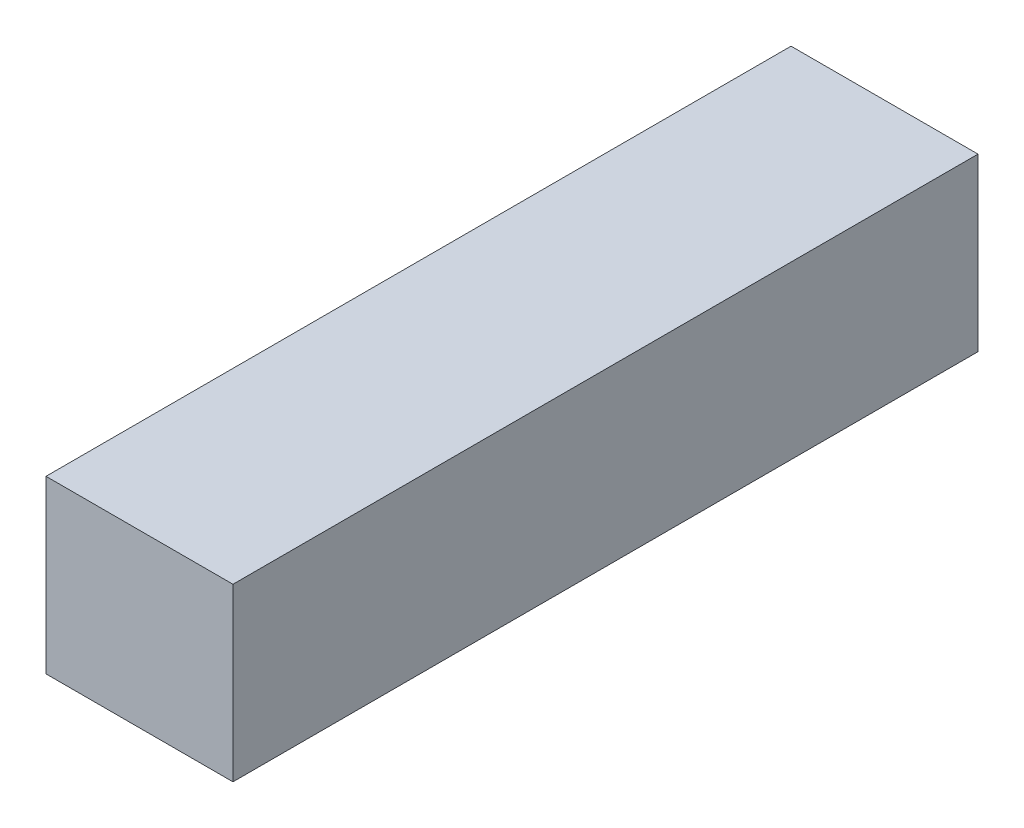
ISO-10303-21;
HEADER;
FILE_DESCRIPTION(('STEP AP214'),'2;1');
FILE_NAME('part.step','',(''),(''),'','','');
FILE_SCHEMA(('AUTOMOTIVE_DESIGN { 1 0 10303 214 1 1 1 1 }'));
ENDSEC;
DATA;
#1=APPLICATION_CONTEXT('core data for automotive mechanical design processes');
#2=APPLICATION_PROTOCOL_DEFINITION('international standard','automotive_design',2000,#1);
#3=PRODUCT_CONTEXT('',#1,'mechanical');
#4=PRODUCT('Part','Part','',(#3));
#5=PRODUCT_RELATED_PRODUCT_CATEGORY('part','',(#4));
#6=PRODUCT_DEFINITION_FORMATION('','',#4);
#7=PRODUCT_DEFINITION_CONTEXT('part definition',#1,'design');
#8=PRODUCT_DEFINITION('design','',#6,#7);
#9=PRODUCT_DEFINITION_SHAPE('','',#8);
#10=(LENGTH_UNIT() NAMED_UNIT(*) SI_UNIT(.MILLI.,.METRE.));
#11=(NAMED_UNIT(*) PLANE_ANGLE_UNIT() SI_UNIT($,.RADIAN.));
#12=(NAMED_UNIT(*) SI_UNIT($,.STERADIAN.) SOLID_ANGLE_UNIT());
#13=UNCERTAINTY_MEASURE_WITH_UNIT(LENGTH_MEASURE(1.E-05),#10,'distance_accuracy_value','');
#14=(GEOMETRIC_REPRESENTATION_CONTEXT(3) GLOBAL_UNCERTAINTY_ASSIGNED_CONTEXT((#13)) GLOBAL_UNIT_ASSIGNED_CONTEXT((#10,
#11,#12)) REPRESENTATION_CONTEXT('',''));
#15=CARTESIAN_POINT('',(0.,0.,0.));
#16=DIRECTION('',(0.,0.,1.));
#17=DIRECTION('',(1.,0.,0.));
#18=AXIS2_PLACEMENT_3D('',#15,#16,#17);
#19=CARTESIAN_POINT('',(5.586378185882,1.4780431679862,0.));
#20=DIRECTION('',(1.,0.,0.));
#21=DIRECTION('',(0.,1.,0.));
#22=AXIS2_PLACEMENT_3D('',#19,#20,#21);
#23=PLANE('',#22);
#24=DIRECTION('',(0.,-1.,0.));
#25=VECTOR('',#24,1.);
#26=CARTESIAN_POINT('',(5.586378185882,1.5010119861224,0.));
#27=LINE('',#26,#25);
#28=CARTESIAN_POINT('',(5.586378185882,1.5010119861224,0.));
#29=VERTEX_POINT('',#28);
#30=CARTESIAN_POINT('',(5.586378185882,1.4780431679862,0.));
#31=VERTEX_POINT('',#30);
#32=EDGE_CURVE('E11',#29,#31,#27,.T.);
#33=ORIENTED_EDGE('',*,*,#32,.F.);
#34=DIRECTION('',(0.,0.,1.));
#35=VECTOR('',#34,1.);
#36=CARTESIAN_POINT('',(5.586378185882,1.5010119861224,0.));
#37=LINE('',#36,#35);
#38=CARTESIAN_POINT('',(5.586378185882,1.5010119861224,0.1));
#39=VERTEX_POINT('',#38);
#40=EDGE_CURVE('E24',#29,#39,#37,.T.);
#41=ORIENTED_EDGE('',*,*,#40,.T.);
#42=DIRECTION('',(0.,1.,0.));
#43=VECTOR('',#42,1.);
#44=CARTESIAN_POINT('',(5.586378185882,1.5010119861224,0.1));
#45=LINE('',#44,#43);
#46=CARTESIAN_POINT('',(5.586378185882,1.4780431679862,0.1));
#47=VERTEX_POINT('',#46);
#48=EDGE_CURVE('E75',#47,#39,#45,.T.);
#49=ORIENTED_EDGE('',*,*,#48,.F.);
#50=DIRECTION('',(0.,0.,1.));
#51=VECTOR('',#50,1.);
#52=CARTESIAN_POINT('',(5.586378185882,1.4780431679862,0.));
#53=LINE('',#52,#51);
#54=EDGE_CURVE('E85',#31,#47,#53,.T.);
#55=ORIENTED_EDGE('',*,*,#54,.F.);
#56=EDGE_LOOP('',(#33,#41,#49,#55));
#57=FACE_BOUND('',#56,.T.);
#58=ADVANCED_FACE('F17',(#57),#23,.T.);
#59=CARTESIAN_POINT('',(5.5612826253258,1.4780431679862,0.));
#60=DIRECTION('',(0.,-1.,0.));
#61=DIRECTION('',(1.,0.,0.));
#62=AXIS2_PLACEMENT_3D('',#59,#60,#61);
#63=PLANE('',#62);
#64=DIRECTION('',(-1.,0.,0.));
#65=VECTOR('',#64,1.);
#66=CARTESIAN_POINT('',(5.586378185882,1.4780431679862,0.));
#67=LINE('',#66,#65);
#68=CARTESIAN_POINT('',(5.5612826253258,1.4780431679862,0.));
#69=VERTEX_POINT('',#68);
#70=EDGE_CURVE('E83',#31,#69,#67,.T.);
#71=ORIENTED_EDGE('',*,*,#70,.F.);
#72=ORIENTED_EDGE('',*,*,#54,.T.);
#73=DIRECTION('',(1.,0.,0.));
#74=VECTOR('',#73,1.);
#75=CARTESIAN_POINT('',(5.586378185882,1.4780431679862,0.1));
#76=LINE('',#75,#74);
#77=CARTESIAN_POINT('',(5.5612826253258,1.4780431679862,0.1));
#78=VERTEX_POINT('',#77);
#79=EDGE_CURVE('E81',#78,#47,#76,.T.);
#80=ORIENTED_EDGE('',*,*,#79,.F.);
#81=DIRECTION('',(0.,0.,1.));
#82=VECTOR('',#81,1.);
#83=CARTESIAN_POINT('',(5.5612826253258,1.4780431679862,0.));
#84=LINE('',#83,#82);
#85=EDGE_CURVE('E61',#69,#78,#84,.T.);
#86=ORIENTED_EDGE('',*,*,#85,.F.);
#87=EDGE_LOOP('',(#71,#72,#80,#86));
#88=FACE_BOUND('',#87,.T.);
#89=ADVANCED_FACE('F91',(#88),#63,.T.);
#90=CARTESIAN_POINT('',(5.5612826253258,1.5010119861224,0.));
#91=DIRECTION('',(-1.,0.,0.));
#92=DIRECTION('',(0.,-1.,0.));
#93=AXIS2_PLACEMENT_3D('',#90,#91,#92);
#94=PLANE('',#93);
#95=DIRECTION('',(0.,1.,0.));
#96=VECTOR('',#95,1.);
#97=CARTESIAN_POINT('',(5.5612826253258,1.4780431679862,0.));
#98=LINE('',#97,#96);
#99=CARTESIAN_POINT('',(5.5612826253258,1.5010119861224,0.));
#100=VERTEX_POINT('',#99);
#101=EDGE_CURVE('E65',#69,#100,#98,.T.);
#102=ORIENTED_EDGE('',*,*,#101,.F.);
#103=ORIENTED_EDGE('',*,*,#85,.T.);
#104=DIRECTION('',(0.,-1.,0.));
#105=VECTOR('',#104,1.);
#106=CARTESIAN_POINT('',(5.5612826253258,1.4780431679862,0.1));
#107=LINE('',#106,#105);
#108=CARTESIAN_POINT('',(5.5612826253258,1.5010119861224,0.1));
#109=VERTEX_POINT('',#108);
#110=EDGE_CURVE('E54',#109,#78,#107,.T.);
#111=ORIENTED_EDGE('',*,*,#110,.F.);
#112=DIRECTION('',(0.,0.,1.));
#113=VECTOR('',#112,1.);
#114=CARTESIAN_POINT('',(5.5612826253258,1.5010119861224,0.));
#115=LINE('',#114,#113);
#116=EDGE_CURVE('E58',#100,#109,#115,.T.);
#117=ORIENTED_EDGE('',*,*,#116,.F.);
#118=EDGE_LOOP('',(#102,#103,#111,#117));
#119=FACE_BOUND('',#118,.T.);
#120=ADVANCED_FACE('F57',(#119),#94,.T.);
#121=CARTESIAN_POINT('',(5.586378185882,1.5010119861224,0.));
#122=DIRECTION('',(0.,1.,0.));
#123=DIRECTION('',(-1.,0.,0.));
#124=AXIS2_PLACEMENT_3D('',#121,#122,#123);
#125=PLANE('',#124);
#126=DIRECTION('',(1.,0.,0.));
#127=VECTOR('',#126,1.);
#128=CARTESIAN_POINT('',(5.5612826253258,1.5010119861224,0.));
#129=LINE('',#128,#127);
#130=EDGE_CURVE('E71',#100,#29,#129,.T.);
#131=ORIENTED_EDGE('',*,*,#130,.F.);
#132=ORIENTED_EDGE('',*,*,#116,.T.);
#133=DIRECTION('',(-1.,0.,0.));
#134=VECTOR('',#133,1.);
#135=CARTESIAN_POINT('',(5.5612826253258,1.5010119861224,0.1));
#136=LINE('',#135,#134);
#137=EDGE_CURVE('E70',#39,#109,#136,.T.);
#138=ORIENTED_EDGE('',*,*,#137,.F.);
#139=ORIENTED_EDGE('',*,*,#40,.F.);
#140=EDGE_LOOP('',(#131,#132,#138,#139));
#141=FACE_BOUND('',#140,.T.);
#142=ADVANCED_FACE('F69',(#141),#125,.T.);
#143=CARTESIAN_POINT('',(5.5738304056039,1.4895275770543,0.));
#144=DIRECTION('',(0.,0.,1.));
#145=DIRECTION('',(1.,0.,0.));
#146=AXIS2_PLACEMENT_3D('',#143,#144,#145);
#147=PLANE('',#146);
#148=ORIENTED_EDGE('',*,*,#130,.T.);
#149=ORIENTED_EDGE('',*,*,#32,.T.);
#150=ORIENTED_EDGE('',*,*,#70,.T.);
#151=ORIENTED_EDGE('',*,*,#101,.T.);
#152=EDGE_LOOP('',(#148,#149,#150,#151));
#153=FACE_BOUND('',#152,.T.);
#154=ADVANCED_FACE('F88',(#153),#147,.F.);
#155=CARTESIAN_POINT('',(5.5738304056039,1.4895275770543,0.1));
#156=DIRECTION('',(0.,0.,1.));
#157=DIRECTION('',(1.,0.,0.));
#158=AXIS2_PLACEMENT_3D('',#155,#156,#157);
#159=PLANE('',#158);
#160=ORIENTED_EDGE('',*,*,#137,.T.);
#161=ORIENTED_EDGE('',*,*,#110,.T.);
#162=ORIENTED_EDGE('',*,*,#79,.T.);
#163=ORIENTED_EDGE('',*,*,#48,.T.);
#164=EDGE_LOOP('',(#160,#161,#162,#163));
#165=FACE_BOUND('',#164,.T.);
#166=ADVANCED_FACE('F74',(#165),#159,.T.);
#167=CLOSED_SHELL('',(#58,#89,#120,#142,#154,#166));
#168=MANIFOLD_SOLID_BREP('B1',#167);
#169=ADVANCED_BREP_SHAPE_REPRESENTATION('',(#18,#168),#14);
#170=SHAPE_DEFINITION_REPRESENTATION(#9,#169);
ENDSEC;
END-ISO-10303-21;
